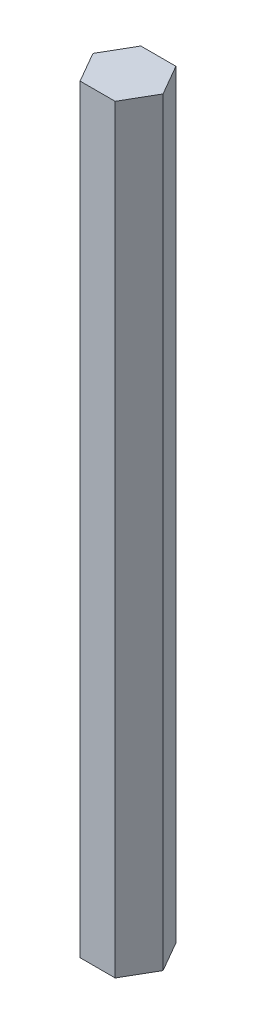
ISO-10303-21;
HEADER;
FILE_DESCRIPTION(('STEP AP214'),'2;1');
FILE_NAME('part.step','',(''),(''),'','','');
FILE_SCHEMA(('AUTOMOTIVE_DESIGN { 1 0 10303 214 1 1 1 1 }'));
ENDSEC;
DATA;
#1=APPLICATION_CONTEXT('core data for automotive mechanical design processes');
#2=APPLICATION_PROTOCOL_DEFINITION('international standard','automotive_design',2000,#1);
#3=PRODUCT_CONTEXT('',#1,'mechanical');
#4=PRODUCT('Part','Part','',(#3));
#5=PRODUCT_RELATED_PRODUCT_CATEGORY('part','',(#4));
#6=PRODUCT_DEFINITION_FORMATION('','',#4);
#7=PRODUCT_DEFINITION_CONTEXT('part definition',#1,'design');
#8=PRODUCT_DEFINITION('design','',#6,#7);
#9=PRODUCT_DEFINITION_SHAPE('','',#8);
#10=(LENGTH_UNIT() NAMED_UNIT(*) SI_UNIT(.MILLI.,.METRE.));
#11=(NAMED_UNIT(*) PLANE_ANGLE_UNIT() SI_UNIT($,.RADIAN.));
#12=(NAMED_UNIT(*) SI_UNIT($,.STERADIAN.) SOLID_ANGLE_UNIT());
#13=UNCERTAINTY_MEASURE_WITH_UNIT(LENGTH_MEASURE(1.E-05),#10,'distance_accuracy_value','');
#14=(GEOMETRIC_REPRESENTATION_CONTEXT(3) GLOBAL_UNCERTAINTY_ASSIGNED_CONTEXT((#13)) GLOBAL_UNIT_ASSIGNED_CONTEXT((#10,
#11,#12)) REPRESENTATION_CONTEXT('',''));
#15=CARTESIAN_POINT('',(0.,0.,0.));
#16=DIRECTION('',(0.,0.,1.));
#17=DIRECTION('',(1.,0.,0.));
#18=AXIS2_PLACEMENT_3D('',#15,#16,#17);
#19=CARTESIAN_POINT('',(2.30940107675852,100.,3.99999999999998));
#20=DIRECTION('',(-0.866025403784439,0.,-0.5));
#21=DIRECTION('',(-0.5,0.,0.866025403784439));
#22=AXIS2_PLACEMENT_3D('',#19,#20,#21);
#23=PLANE('',#22);
#24=DIRECTION('',(0.5,0.,-0.866025403784439));
#25=VECTOR('',#24,1.);
#26=CARTESIAN_POINT('',(2.30940107675852,0.,3.99999999999998));
#27=LINE('',#26,#25);
#28=CARTESIAN_POINT('',(2.30940107675852,0.,3.99999999999998));
#29=VERTEX_POINT('',#28);
#30=CARTESIAN_POINT('',(4.618802153517,0.,0.));
#31=VERTEX_POINT('',#30);
#32=EDGE_CURVE('E116',#29,#31,#27,.T.);
#33=ORIENTED_EDGE('',*,*,#32,.T.);
#34=DIRECTION('',(0.,-1.,0.));
#35=VECTOR('',#34,1.);
#36=CARTESIAN_POINT('',(4.618802153517,100.,0.));
#37=LINE('',#36,#35);
#38=CARTESIAN_POINT('',(4.618802153517,100.,0.));
#39=VERTEX_POINT('',#38);
#40=EDGE_CURVE('E11',#39,#31,#37,.T.);
#41=ORIENTED_EDGE('',*,*,#40,.F.);
#42=DIRECTION('',(0.5,0.,-0.866025403784439));
#43=VECTOR('',#42,1.);
#44=CARTESIAN_POINT('',(2.30940107675852,100.,3.99999999999998));
#45=LINE('',#44,#43);
#46=CARTESIAN_POINT('',(2.30940107675852,100.,3.99999999999998));
#47=VERTEX_POINT('',#46);
#48=EDGE_CURVE('E126',#47,#39,#45,.T.);
#49=ORIENTED_EDGE('',*,*,#48,.F.);
#50=DIRECTION('',(0.,-1.,0.));
#51=VECTOR('',#50,1.);
#52=CARTESIAN_POINT('',(2.30940107675852,100.,3.99999999999998));
#53=LINE('',#52,#51);
#54=EDGE_CURVE('E112',#47,#29,#53,.T.);
#55=ORIENTED_EDGE('',*,*,#54,.T.);
#56=EDGE_LOOP('',(#33,#41,#49,#55));
#57=FACE_BOUND('',#56,.T.);
#58=ADVANCED_FACE('F32',(#57),#23,.F.);
#59=CARTESIAN_POINT('',(4.618802153517,100.,0.));
#60=DIRECTION('',(-0.866025403784439,0.,0.499999999999999));
#61=DIRECTION('',(0.499999999999999,0.,0.866025403784439));
#62=AXIS2_PLACEMENT_3D('',#59,#60,#61);
#63=PLANE('',#62);
#64=DIRECTION('',(-0.499999999999999,0.,-0.866025403784439));
#65=VECTOR('',#64,1.);
#66=CARTESIAN_POINT('',(4.618802153517,0.,0.));
#67=LINE('',#66,#65);
#68=CARTESIAN_POINT('',(2.30940107675848,0.,-4.));
#69=VERTEX_POINT('',#68);
#70=EDGE_CURVE('E119',#31,#69,#67,.T.);
#71=ORIENTED_EDGE('',*,*,#70,.T.);
#72=DIRECTION('',(0.,-1.,0.));
#73=VECTOR('',#72,1.);
#74=CARTESIAN_POINT('',(2.30940107675848,100.,-4.));
#75=LINE('',#74,#73);
#76=CARTESIAN_POINT('',(2.30940107675848,100.,-4.));
#77=VERTEX_POINT('',#76);
#78=EDGE_CURVE('E40',#77,#69,#75,.T.);
#79=ORIENTED_EDGE('',*,*,#78,.F.);
#80=DIRECTION('',(-0.499999999999999,0.,-0.866025403784439));
#81=VECTOR('',#80,1.);
#82=CARTESIAN_POINT('',(4.618802153517,100.,0.));
#83=LINE('',#82,#81);
#84=EDGE_CURVE('E85',#39,#77,#83,.T.);
#85=ORIENTED_EDGE('',*,*,#84,.F.);
#86=ORIENTED_EDGE('',*,*,#40,.T.);
#87=EDGE_LOOP('',(#71,#79,#85,#86));
#88=FACE_BOUND('',#87,.T.);
#89=ADVANCED_FACE('F150',(#88),#63,.F.);
#90=CARTESIAN_POINT('',(2.30940107675848,100.,-4.));
#91=DIRECTION('',(0.,0.,1.));
#92=DIRECTION('',(1.,0.,0.));
#93=AXIS2_PLACEMENT_3D('',#90,#91,#92);
#94=PLANE('',#93);
#95=DIRECTION('',(-1.,0.,0.));
#96=VECTOR('',#95,1.);
#97=CARTESIAN_POINT('',(2.30940107675848,0.,-4.));
#98=LINE('',#97,#96);
#99=CARTESIAN_POINT('',(-2.3094010767585,0.,-4.));
#100=VERTEX_POINT('',#99);
#101=EDGE_CURVE('E121',#69,#100,#98,.T.);
#102=ORIENTED_EDGE('',*,*,#101,.T.);
#103=DIRECTION('',(0.,-1.,0.));
#104=VECTOR('',#103,1.);
#105=CARTESIAN_POINT('',(-2.3094010767585,100.,-4.));
#106=LINE('',#105,#104);
#107=CARTESIAN_POINT('',(-2.3094010767585,100.,-4.));
#108=VERTEX_POINT('',#107);
#109=EDGE_CURVE('E107',#108,#100,#106,.T.);
#110=ORIENTED_EDGE('',*,*,#109,.F.);
#111=DIRECTION('',(-1.,0.,0.));
#112=VECTOR('',#111,1.);
#113=CARTESIAN_POINT('',(2.30940107675848,100.,-4.));
#114=LINE('',#113,#112);
#115=EDGE_CURVE('E98',#77,#108,#114,.T.);
#116=ORIENTED_EDGE('',*,*,#115,.F.);
#117=ORIENTED_EDGE('',*,*,#78,.T.);
#118=EDGE_LOOP('',(#102,#110,#116,#117));
#119=FACE_BOUND('',#118,.T.);
#120=ADVANCED_FACE('F132',(#119),#94,.F.);
#121=CARTESIAN_POINT('',(-2.3094010767585,100.,-4.));
#122=DIRECTION('',(0.866025403784438,0.,0.500000000000001));
#123=DIRECTION('',(0.500000000000001,0.,-0.866025403784438));
#124=AXIS2_PLACEMENT_3D('',#121,#122,#123);
#125=PLANE('',#124);
#126=DIRECTION('',(-0.500000000000001,0.,0.866025403784438));
#127=VECTOR('',#126,1.);
#128=CARTESIAN_POINT('',(-2.3094010767585,0.,-4.));
#129=LINE('',#128,#127);
#130=CARTESIAN_POINT('',(-4.61880215351701,0.,0.));
#131=VERTEX_POINT('',#130);
#132=EDGE_CURVE('E106',#100,#131,#129,.T.);
#133=ORIENTED_EDGE('',*,*,#132,.T.);
#134=DIRECTION('',(0.,-1.,0.));
#135=VECTOR('',#134,1.);
#136=CARTESIAN_POINT('',(-4.61880215351701,100.,0.));
#137=LINE('',#136,#135);
#138=CARTESIAN_POINT('',(-4.61880215351701,100.,0.));
#139=VERTEX_POINT('',#138);
#140=EDGE_CURVE('E103',#139,#131,#137,.T.);
#141=ORIENTED_EDGE('',*,*,#140,.F.);
#142=DIRECTION('',(-0.500000000000001,0.,0.866025403784438));
#143=VECTOR('',#142,1.);
#144=CARTESIAN_POINT('',(-2.3094010767585,100.,-4.));
#145=LINE('',#144,#143);
#146=EDGE_CURVE('E92',#108,#139,#145,.T.);
#147=ORIENTED_EDGE('',*,*,#146,.F.);
#148=ORIENTED_EDGE('',*,*,#109,.T.);
#149=EDGE_LOOP('',(#133,#141,#147,#148));
#150=FACE_BOUND('',#149,.T.);
#151=ADVANCED_FACE('F104',(#150),#125,.F.);
#152=CARTESIAN_POINT('',(-4.61880215351701,100.,0.));
#153=DIRECTION('',(0.866025403784438,0.,-0.500000000000001));
#154=DIRECTION('',(-0.500000000000001,0.,-0.866025403784438));
#155=AXIS2_PLACEMENT_3D('',#152,#153,#154);
#156=PLANE('',#155);
#157=DIRECTION('',(0.500000000000001,0.,0.866025403784438));
#158=VECTOR('',#157,1.);
#159=CARTESIAN_POINT('',(-4.61880215351701,0.,0.));
#160=LINE('',#159,#158);
#161=CARTESIAN_POINT('',(-2.3094010767585,0.,3.99999999999999));
#162=VERTEX_POINT('',#161);
#163=EDGE_CURVE('E71',#131,#162,#160,.T.);
#164=ORIENTED_EDGE('',*,*,#163,.T.);
#165=DIRECTION('',(0.,-1.,0.));
#166=VECTOR('',#165,1.);
#167=CARTESIAN_POINT('',(-2.3094010767585,100.,3.99999999999999));
#168=LINE('',#167,#166);
#169=CARTESIAN_POINT('',(-2.3094010767585,100.,3.99999999999999));
#170=VERTEX_POINT('',#169);
#171=EDGE_CURVE('E108',#170,#162,#168,.T.);
#172=ORIENTED_EDGE('',*,*,#171,.F.);
#173=DIRECTION('',(0.500000000000001,0.,0.866025403784438));
#174=VECTOR('',#173,1.);
#175=CARTESIAN_POINT('',(-4.61880215351701,100.,0.));
#176=LINE('',#175,#174);
#177=EDGE_CURVE('E96',#139,#170,#176,.T.);
#178=ORIENTED_EDGE('',*,*,#177,.F.);
#179=ORIENTED_EDGE('',*,*,#140,.T.);
#180=EDGE_LOOP('',(#164,#172,#178,#179));
#181=FACE_BOUND('',#180,.T.);
#182=ADVANCED_FACE('F110',(#181),#156,.F.);
#183=CARTESIAN_POINT('',(-2.3094010767585,100.,3.99999999999999));
#184=DIRECTION('',(0.,0.,-1.));
#185=DIRECTION('',(-1.,0.,0.));
#186=AXIS2_PLACEMENT_3D('',#183,#184,#185);
#187=PLANE('',#186);
#188=DIRECTION('',(1.,0.,0.));
#189=VECTOR('',#188,1.);
#190=CARTESIAN_POINT('',(-2.3094010767585,0.,3.99999999999999));
#191=LINE('',#190,#189);
#192=EDGE_CURVE('E77',#162,#29,#191,.T.);
#193=ORIENTED_EDGE('',*,*,#192,.T.);
#194=ORIENTED_EDGE('',*,*,#54,.F.);
#195=DIRECTION('',(1.,0.,0.));
#196=VECTOR('',#195,1.);
#197=CARTESIAN_POINT('',(-2.3094010767585,100.,3.99999999999999));
#198=LINE('',#197,#196);
#199=EDGE_CURVE('E48',#170,#47,#198,.T.);
#200=ORIENTED_EDGE('',*,*,#199,.F.);
#201=ORIENTED_EDGE('',*,*,#171,.T.);
#202=EDGE_LOOP('',(#193,#194,#200,#201));
#203=FACE_BOUND('',#202,.T.);
#204=ADVANCED_FACE('F139',(#203),#187,.F.);
#205=CARTESIAN_POINT('',(0.,100.,0.));
#206=DIRECTION('',(0.,1.,0.));
#207=DIRECTION('',(0.,0.,1.));
#208=AXIS2_PLACEMENT_3D('',#205,#206,#207);
#209=PLANE('',#208);
#210=ORIENTED_EDGE('',*,*,#48,.T.);
#211=ORIENTED_EDGE('',*,*,#84,.T.);
#212=ORIENTED_EDGE('',*,*,#115,.T.);
#213=ORIENTED_EDGE('',*,*,#146,.T.);
#214=ORIENTED_EDGE('',*,*,#177,.T.);
#215=ORIENTED_EDGE('',*,*,#199,.T.);
#216=EDGE_LOOP('',(#210,#211,#212,#213,#214,#215));
#217=FACE_BOUND('',#216,.T.);
#218=ADVANCED_FACE('F94',(#217),#209,.T.);
#219=CARTESIAN_POINT('',(0.,0.,0.));
#220=DIRECTION('',(0.,1.,0.));
#221=DIRECTION('',(0.,0.,1.));
#222=AXIS2_PLACEMENT_3D('',#219,#220,#221);
#223=PLANE('',#222);
#224=ORIENTED_EDGE('',*,*,#32,.F.);
#225=ORIENTED_EDGE('',*,*,#192,.F.);
#226=ORIENTED_EDGE('',*,*,#163,.F.);
#227=ORIENTED_EDGE('',*,*,#132,.F.);
#228=ORIENTED_EDGE('',*,*,#101,.F.);
#229=ORIENTED_EDGE('',*,*,#70,.F.);
#230=EDGE_LOOP('',(#224,#225,#226,#227,#228,#229));
#231=FACE_BOUND('',#230,.T.);
#232=ADVANCED_FACE('F135',(#231),#223,.F.);
#233=CLOSED_SHELL('',(#58,#89,#120,#151,#182,#204,#218,#232));
#234=MANIFOLD_SOLID_BREP('B2',#233);
#235=ADVANCED_BREP_SHAPE_REPRESENTATION('',(#18,#234),#14);
#236=SHAPE_DEFINITION_REPRESENTATION(#9,#235);
ENDSEC;
END-ISO-10303-21;
